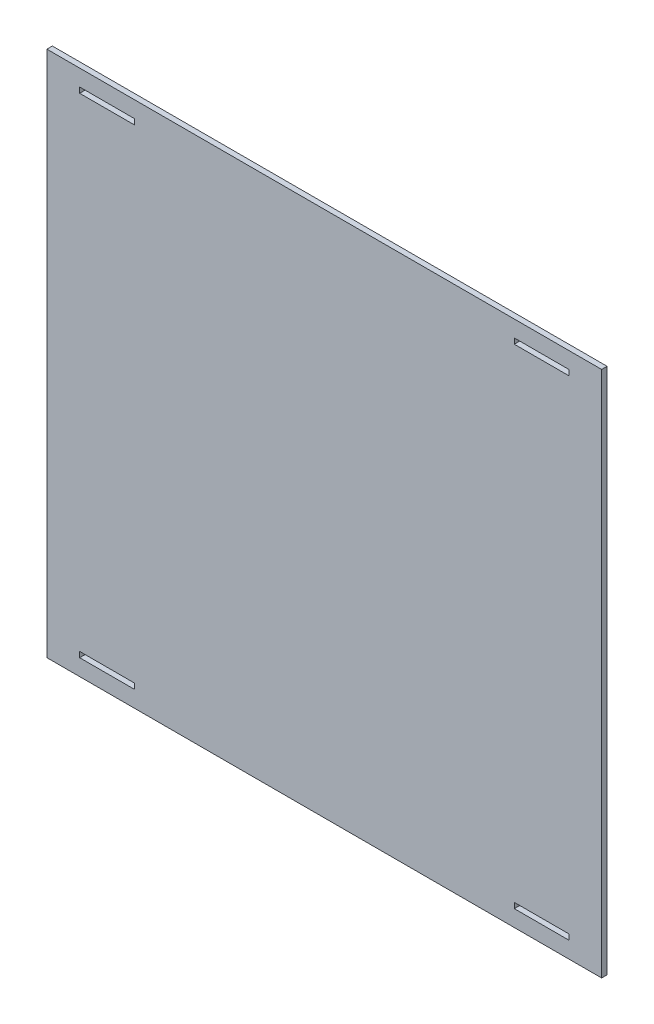
ISO-10303-21;
HEADER;
FILE_DESCRIPTION(('STEP AP214'),'2;1');
FILE_NAME('part.step','',(''),(''),'','','');
FILE_SCHEMA(('AUTOMOTIVE_DESIGN { 1 0 10303 214 1 1 1 1 }'));
ENDSEC;
DATA;
#1=APPLICATION_CONTEXT('core data for automotive mechanical design processes');
#2=APPLICATION_PROTOCOL_DEFINITION('international standard','automotive_design',2000,#1);
#3=PRODUCT_CONTEXT('',#1,'mechanical');
#4=PRODUCT('Part','Part','',(#3));
#5=PRODUCT_RELATED_PRODUCT_CATEGORY('part','',(#4));
#6=PRODUCT_DEFINITION_FORMATION('','',#4);
#7=PRODUCT_DEFINITION_CONTEXT('part definition',#1,'design');
#8=PRODUCT_DEFINITION('design','',#6,#7);
#9=PRODUCT_DEFINITION_SHAPE('','',#8);
#10=(LENGTH_UNIT() NAMED_UNIT(*) SI_UNIT(.MILLI.,.METRE.));
#11=(NAMED_UNIT(*) PLANE_ANGLE_UNIT() SI_UNIT($,.RADIAN.));
#12=(NAMED_UNIT(*) SI_UNIT($,.STERADIAN.) SOLID_ANGLE_UNIT());
#13=UNCERTAINTY_MEASURE_WITH_UNIT(LENGTH_MEASURE(1.E-05),#10,'distance_accuracy_value','');
#14=(GEOMETRIC_REPRESENTATION_CONTEXT(3) GLOBAL_UNCERTAINTY_ASSIGNED_CONTEXT((#13)) GLOBAL_UNIT_ASSIGNED_CONTEXT((#10,
#11,#12)) REPRESENTATION_CONTEXT('',''));
#15=CARTESIAN_POINT('',(0.,0.,0.));
#16=DIRECTION('',(0.,0.,1.));
#17=DIRECTION('',(1.,0.,0.));
#18=AXIS2_PLACEMENT_3D('',#15,#16,#17);
#19=CARTESIAN_POINT('',(0.,0.,5.));
#20=DIRECTION('',(-1.,0.,0.));
#21=DIRECTION('',(0.,-1.,0.));
#22=AXIS2_PLACEMENT_3D('',#19,#20,#21);
#23=PLANE('',#22);
#24=DIRECTION('',(0.,1.,0.));
#25=VECTOR('',#24,1.);
#26=CARTESIAN_POINT('',(0.,0.,0.));
#27=LINE('',#26,#25);
#28=CARTESIAN_POINT('',(0.,0.,0.));
#29=VERTEX_POINT('',#28);
#30=CARTESIAN_POINT('',(0.,482.6,0.));
#31=VERTEX_POINT('',#30);
#32=EDGE_CURVE('E298',#29,#31,#27,.T.);
#33=ORIENTED_EDGE('',*,*,#32,.T.);
#34=DIRECTION('',(0.,0.,-1.));
#35=VECTOR('',#34,1.);
#36=CARTESIAN_POINT('',(0.,482.6,5.));
#37=LINE('',#36,#35);
#38=CARTESIAN_POINT('',(0.,482.6,5.));
#39=VERTEX_POINT('',#38);
#40=EDGE_CURVE('E11',#39,#31,#37,.T.);
#41=ORIENTED_EDGE('',*,*,#40,.F.);
#42=DIRECTION('',(0.,1.,0.));
#43=VECTOR('',#42,1.);
#44=CARTESIAN_POINT('',(0.,0.,5.));
#45=LINE('',#44,#43);
#46=CARTESIAN_POINT('',(0.,0.,5.));
#47=VERTEX_POINT('',#46);
#48=EDGE_CURVE('E305',#47,#39,#45,.T.);
#49=ORIENTED_EDGE('',*,*,#48,.F.);
#50=DIRECTION('',(0.,0.,-1.));
#51=VECTOR('',#50,1.);
#52=CARTESIAN_POINT('',(0.,0.,5.));
#53=LINE('',#52,#51);
#54=EDGE_CURVE('E315',#47,#29,#53,.T.);
#55=ORIENTED_EDGE('',*,*,#54,.T.);
#56=EDGE_LOOP('',(#33,#41,#49,#55));
#57=FACE_BOUND('',#56,.T.);
#58=ADVANCED_FACE('F33',(#57),#23,.F.);
#59=CARTESIAN_POINT('',(0.,482.6,5.));
#60=DIRECTION('',(0.,-1.,0.));
#61=DIRECTION('',(1.,0.,0.));
#62=AXIS2_PLACEMENT_3D('',#59,#60,#61);
#63=PLANE('',#62);
#64=DIRECTION('',(-1.,0.,0.));
#65=VECTOR('',#64,1.);
#66=CARTESIAN_POINT('',(0.,482.6,0.));
#67=LINE('',#66,#65);
#68=CARTESIAN_POINT('',(-508.,482.6,0.));
#69=VERTEX_POINT('',#68);
#70=EDGE_CURVE('E318',#31,#69,#67,.T.);
#71=ORIENTED_EDGE('',*,*,#70,.T.);
#72=DIRECTION('',(0.,0.,-1.));
#73=VECTOR('',#72,1.);
#74=CARTESIAN_POINT('',(-508.,482.6,5.));
#75=LINE('',#74,#73);
#76=CARTESIAN_POINT('',(-508.,482.6,5.));
#77=VERTEX_POINT('',#76);
#78=EDGE_CURVE('E40',#77,#69,#75,.T.);
#79=ORIENTED_EDGE('',*,*,#78,.F.);
#80=DIRECTION('',(-1.,0.,0.));
#81=VECTOR('',#80,1.);
#82=CARTESIAN_POINT('',(0.,482.6,5.));
#83=LINE('',#82,#81);
#84=EDGE_CURVE('E308',#39,#77,#83,.T.);
#85=ORIENTED_EDGE('',*,*,#84,.F.);
#86=ORIENTED_EDGE('',*,*,#40,.T.);
#87=EDGE_LOOP('',(#71,#79,#85,#86));
#88=FACE_BOUND('',#87,.T.);
#89=ADVANCED_FACE('F347',(#88),#63,.F.);
#90=CARTESIAN_POINT('',(-508.,0.,5.));
#91=DIRECTION('',(1.,0.,0.));
#92=DIRECTION('',(0.,0.,-1.));
#93=AXIS2_PLACEMENT_3D('',#90,#91,#92);
#94=PLANE('',#93);
#95=DIRECTION('',(0.,-1.,0.));
#96=VECTOR('',#95,1.);
#97=CARTESIAN_POINT('',(-508.,0.,0.));
#98=LINE('',#97,#96);
#99=CARTESIAN_POINT('',(-508.,0.,0.));
#100=VERTEX_POINT('',#99);
#101=EDGE_CURVE('E320',#69,#100,#98,.T.);
#102=ORIENTED_EDGE('',*,*,#101,.T.);
#103=DIRECTION('',(0.,0.,-1.));
#104=VECTOR('',#103,1.);
#105=CARTESIAN_POINT('',(-508.,0.,5.));
#106=LINE('',#105,#104);
#107=CARTESIAN_POINT('',(-508.,0.,5.));
#108=VERTEX_POINT('',#107);
#109=EDGE_CURVE('E325',#108,#100,#106,.T.);
#110=ORIENTED_EDGE('',*,*,#109,.F.);
#111=DIRECTION('',(0.,-1.,0.));
#112=VECTOR('',#111,1.);
#113=CARTESIAN_POINT('',(-508.,0.,5.));
#114=LINE('',#113,#112);
#115=EDGE_CURVE('E311',#77,#108,#114,.T.);
#116=ORIENTED_EDGE('',*,*,#115,.F.);
#117=ORIENTED_EDGE('',*,*,#78,.T.);
#118=EDGE_LOOP('',(#102,#110,#116,#117));
#119=FACE_BOUND('',#118,.T.);
#120=ADVANCED_FACE('F332',(#119),#94,.F.);
#121=CARTESIAN_POINT('',(0.,0.,5.));
#122=DIRECTION('',(0.,1.,0.));
#123=DIRECTION('',(-1.,0.,0.));
#124=AXIS2_PLACEMENT_3D('',#121,#122,#123);
#125=PLANE('',#124);
#126=DIRECTION('',(1.,0.,0.));
#127=VECTOR('',#126,1.);
#128=CARTESIAN_POINT('',(0.,0.,0.));
#129=LINE('',#128,#127);
#130=EDGE_CURVE('E309',#100,#29,#129,.T.);
#131=ORIENTED_EDGE('',*,*,#130,.T.);
#132=ORIENTED_EDGE('',*,*,#54,.F.);
#133=DIRECTION('',(1.,0.,0.));
#134=VECTOR('',#133,1.);
#135=CARTESIAN_POINT('',(0.,0.,5.));
#136=LINE('',#135,#134);
#137=EDGE_CURVE('E313',#108,#47,#136,.T.);
#138=ORIENTED_EDGE('',*,*,#137,.F.);
#139=ORIENTED_EDGE('',*,*,#109,.T.);
#140=EDGE_LOOP('',(#131,#132,#138,#139));
#141=FACE_BOUND('',#140,.T.);
#142=ADVANCED_FACE('F340',(#141),#125,.F.);
#143=CARTESIAN_POINT('',(0.,0.,5.));
#144=DIRECTION('',(0.,0.,1.));
#145=DIRECTION('',(1.,0.,0.));
#146=AXIS2_PLACEMENT_3D('',#143,#144,#145);
#147=PLANE('',#146);
#148=DIRECTION('',(0.,-1.,0.));
#149=VECTOR('',#148,1.);
#150=CARTESIAN_POINT('',(-478.,19.9999999999999,5.));
#151=LINE('',#150,#149);
#152=CARTESIAN_POINT('',(-478.,19.9999999999999,5.));
#153=VERTEX_POINT('',#152);
#154=CARTESIAN_POINT('',(-478.,14.9999999999999,5.));
#155=VERTEX_POINT('',#154);
#156=EDGE_CURVE('E47',#153,#155,#151,.T.);
#157=ORIENTED_EDGE('',*,*,#156,.F.);
#158=DIRECTION('',(-1.,0.,0.));
#159=VECTOR('',#158,1.);
#160=CARTESIAN_POINT('',(-478.,19.9999999999999,5.));
#161=LINE('',#160,#159);
#162=CARTESIAN_POINT('',(-428.,19.9999999999999,5.));
#163=VERTEX_POINT('',#162);
#164=EDGE_CURVE('E248',#163,#153,#161,.T.);
#165=ORIENTED_EDGE('',*,*,#164,.F.);
#166=DIRECTION('',(0.,1.,0.));
#167=VECTOR('',#166,1.);
#168=CARTESIAN_POINT('',(-428.,19.9999999999999,5.));
#169=LINE('',#168,#167);
#170=CARTESIAN_POINT('',(-428.,14.9999999999999,5.));
#171=VERTEX_POINT('',#170);
#172=EDGE_CURVE('E262',#171,#163,#169,.T.);
#173=ORIENTED_EDGE('',*,*,#172,.F.);
#174=DIRECTION('',(1.,0.,0.));
#175=VECTOR('',#174,1.);
#176=CARTESIAN_POINT('',(-478.,14.9999999999999,5.));
#177=LINE('',#176,#175);
#178=EDGE_CURVE('E259',#155,#171,#177,.T.);
#179=ORIENTED_EDGE('',*,*,#178,.F.);
#180=EDGE_LOOP('',(#157,#165,#173,#179));
#181=FACE_BOUND('',#180,.T.);
#182=DIRECTION('',(0.,1.,0.));
#183=VECTOR('',#182,1.);
#184=CARTESIAN_POINT('',(-30.,15.,5.));
#185=LINE('',#184,#183);
#186=CARTESIAN_POINT('',(-30.,15.,5.));
#187=VERTEX_POINT('',#186);
#188=CARTESIAN_POINT('',(-30.,20.,5.));
#189=VERTEX_POINT('',#188);
#190=EDGE_CURVE('E55',#187,#189,#185,.T.);
#191=ORIENTED_EDGE('',*,*,#190,.F.);
#192=DIRECTION('',(1.,0.,0.));
#193=VECTOR('',#192,1.);
#194=CARTESIAN_POINT('',(-30.,15.,5.));
#195=LINE('',#194,#193);
#196=CARTESIAN_POINT('',(-80.,15.,5.));
#197=VERTEX_POINT('',#196);
#198=EDGE_CURVE('E218',#197,#187,#195,.T.);
#199=ORIENTED_EDGE('',*,*,#198,.F.);
#200=DIRECTION('',(0.,-1.,0.));
#201=VECTOR('',#200,1.);
#202=CARTESIAN_POINT('',(-80.,15.,5.));
#203=LINE('',#202,#201);
#204=CARTESIAN_POINT('',(-80.,20.,5.));
#205=VERTEX_POINT('',#204);
#206=EDGE_CURVE('E233',#205,#197,#203,.T.);
#207=ORIENTED_EDGE('',*,*,#206,.F.);
#208=DIRECTION('',(-1.,0.,0.));
#209=VECTOR('',#208,1.);
#210=CARTESIAN_POINT('',(-30.,20.,5.));
#211=LINE('',#210,#209);
#212=EDGE_CURVE('E229',#189,#205,#211,.T.);
#213=ORIENTED_EDGE('',*,*,#212,.F.);
#214=EDGE_LOOP('',(#191,#199,#207,#213));
#215=FACE_BOUND('',#214,.T.);
#216=DIRECTION('',(0.,1.,0.));
#217=VECTOR('',#216,1.);
#218=CARTESIAN_POINT('',(-30.,467.6,5.));
#219=LINE('',#218,#217);
#220=CARTESIAN_POINT('',(-30.,462.6,5.));
#221=VERTEX_POINT('',#220);
#222=CARTESIAN_POINT('',(-30.,467.6,5.));
#223=VERTEX_POINT('',#222);
#224=EDGE_CURVE('E176',#221,#223,#219,.T.);
#225=ORIENTED_EDGE('',*,*,#224,.F.);
#226=DIRECTION('',(1.,0.,0.));
#227=VECTOR('',#226,1.);
#228=CARTESIAN_POINT('',(-30.,462.6,5.));
#229=LINE('',#228,#227);
#230=CARTESIAN_POINT('',(-80.,462.6,5.));
#231=VERTEX_POINT('',#230);
#232=EDGE_CURVE('E194',#231,#221,#229,.T.);
#233=ORIENTED_EDGE('',*,*,#232,.F.);
#234=DIRECTION('',(0.,-1.,0.));
#235=VECTOR('',#234,1.);
#236=CARTESIAN_POINT('',(-80.,467.6,5.));
#237=LINE('',#236,#235);
#238=CARTESIAN_POINT('',(-80.,467.6,5.));
#239=VERTEX_POINT('',#238);
#240=EDGE_CURVE('E197',#239,#231,#237,.T.);
#241=ORIENTED_EDGE('',*,*,#240,.F.);
#242=DIRECTION('',(-1.,0.,0.));
#243=VECTOR('',#242,1.);
#244=CARTESIAN_POINT('',(-30.,467.6,5.));
#245=LINE('',#244,#243);
#246=EDGE_CURVE('E203',#223,#239,#245,.T.);
#247=ORIENTED_EDGE('',*,*,#246,.F.);
#248=EDGE_LOOP('',(#225,#233,#241,#247));
#249=FACE_BOUND('',#248,.T.);
#250=DIRECTION('',(0.,-1.,0.));
#251=VECTOR('',#250,1.);
#252=CARTESIAN_POINT('',(-478.,467.6,5.));
#253=LINE('',#252,#251);
#254=CARTESIAN_POINT('',(-478.,467.6,5.));
#255=VERTEX_POINT('',#254);
#256=CARTESIAN_POINT('',(-478.,462.6,5.));
#257=VERTEX_POINT('',#256);
#258=EDGE_CURVE('E210',#255,#257,#253,.T.);
#259=ORIENTED_EDGE('',*,*,#258,.F.);
#260=DIRECTION('',(-1.,0.,0.));
#261=VECTOR('',#260,1.);
#262=CARTESIAN_POINT('',(-478.,467.6,5.));
#263=LINE('',#262,#261);
#264=CARTESIAN_POINT('',(-428.,467.6,5.));
#265=VERTEX_POINT('',#264);
#266=EDGE_CURVE('E277',#265,#255,#263,.T.);
#267=ORIENTED_EDGE('',*,*,#266,.F.);
#268=DIRECTION('',(0.,1.,0.));
#269=VECTOR('',#268,1.);
#270=CARTESIAN_POINT('',(-428.,467.6,5.));
#271=LINE('',#270,#269);
#272=CARTESIAN_POINT('',(-428.,462.6,5.));
#273=VERTEX_POINT('',#272);
#274=EDGE_CURVE('E291',#273,#265,#271,.T.);
#275=ORIENTED_EDGE('',*,*,#274,.F.);
#276=DIRECTION('',(1.,0.,0.));
#277=VECTOR('',#276,1.);
#278=CARTESIAN_POINT('',(-478.,462.6,5.));
#279=LINE('',#278,#277);
#280=EDGE_CURVE('E288',#257,#273,#279,.T.);
#281=ORIENTED_EDGE('',*,*,#280,.F.);
#282=EDGE_LOOP('',(#259,#267,#275,#281));
#283=FACE_BOUND('',#282,.T.);
#284=ORIENTED_EDGE('',*,*,#48,.T.);
#285=ORIENTED_EDGE('',*,*,#84,.T.);
#286=ORIENTED_EDGE('',*,*,#115,.T.);
#287=ORIENTED_EDGE('',*,*,#137,.T.);
#288=EDGE_LOOP('',(#284,#285,#286,#287));
#289=FACE_BOUND('',#288,.T.);
#290=ADVANCED_FACE('F346',(#181,#215,#249,#283,#289),#147,.T.);
#291=CARTESIAN_POINT('',(0.,0.,0.));
#292=DIRECTION('',(0.,0.,1.));
#293=DIRECTION('',(1.,0.,0.));
#294=AXIS2_PLACEMENT_3D('',#291,#292,#293);
#295=PLANE('',#294);
#296=DIRECTION('',(-1.,0.,0.));
#297=VECTOR('',#296,1.);
#298=CARTESIAN_POINT('',(-478.,19.9999999999999,0.));
#299=LINE('',#298,#297);
#300=CARTESIAN_POINT('',(-428.,19.9999999999999,0.));
#301=VERTEX_POINT('',#300);
#302=CARTESIAN_POINT('',(-478.,19.9999999999999,0.));
#303=VERTEX_POINT('',#302);
#304=EDGE_CURVE('E254',#301,#303,#299,.T.);
#305=ORIENTED_EDGE('',*,*,#304,.T.);
#306=DIRECTION('',(0.,-1.,0.));
#307=VECTOR('',#306,1.);
#308=CARTESIAN_POINT('',(-478.,19.9999999999999,0.));
#309=LINE('',#308,#307);
#310=CARTESIAN_POINT('',(-478.,14.9999999999999,0.));
#311=VERTEX_POINT('',#310);
#312=EDGE_CURVE('E244',#303,#311,#309,.T.);
#313=ORIENTED_EDGE('',*,*,#312,.T.);
#314=DIRECTION('',(1.,0.,0.));
#315=VECTOR('',#314,1.);
#316=CARTESIAN_POINT('',(-478.,14.9999999999999,0.));
#317=LINE('',#316,#315);
#318=CARTESIAN_POINT('',(-428.,14.9999999999999,0.));
#319=VERTEX_POINT('',#318);
#320=EDGE_CURVE('E247',#311,#319,#317,.T.);
#321=ORIENTED_EDGE('',*,*,#320,.T.);
#322=DIRECTION('',(0.,1.,0.));
#323=VECTOR('',#322,1.);
#324=CARTESIAN_POINT('',(-428.,19.9999999999999,0.));
#325=LINE('',#324,#323);
#326=EDGE_CURVE('E251',#319,#301,#325,.T.);
#327=ORIENTED_EDGE('',*,*,#326,.T.);
#328=EDGE_LOOP('',(#305,#313,#321,#327));
#329=FACE_BOUND('',#328,.T.);
#330=DIRECTION('',(1.,0.,0.));
#331=VECTOR('',#330,1.);
#332=CARTESIAN_POINT('',(-30.,15.,0.));
#333=LINE('',#332,#331);
#334=CARTESIAN_POINT('',(-80.,15.,0.));
#335=VERTEX_POINT('',#334);
#336=CARTESIAN_POINT('',(-30.,15.,0.));
#337=VERTEX_POINT('',#336);
#338=EDGE_CURVE('E224',#335,#337,#333,.T.);
#339=ORIENTED_EDGE('',*,*,#338,.T.);
#340=DIRECTION('',(0.,1.,0.));
#341=VECTOR('',#340,1.);
#342=CARTESIAN_POINT('',(-30.,15.,0.));
#343=LINE('',#342,#341);
#344=CARTESIAN_POINT('',(-30.,20.,0.));
#345=VERTEX_POINT('',#344);
#346=EDGE_CURVE('E214',#337,#345,#343,.T.);
#347=ORIENTED_EDGE('',*,*,#346,.T.);
#348=DIRECTION('',(-1.,0.,0.));
#349=VECTOR('',#348,1.);
#350=CARTESIAN_POINT('',(-30.,20.,0.));
#351=LINE('',#350,#349);
#352=CARTESIAN_POINT('',(-80.,20.,0.));
#353=VERTEX_POINT('',#352);
#354=EDGE_CURVE('E217',#345,#353,#351,.T.);
#355=ORIENTED_EDGE('',*,*,#354,.T.);
#356=DIRECTION('',(0.,-1.,0.));
#357=VECTOR('',#356,1.);
#358=CARTESIAN_POINT('',(-80.,15.,0.));
#359=LINE('',#358,#357);
#360=EDGE_CURVE('E221',#353,#335,#359,.T.);
#361=ORIENTED_EDGE('',*,*,#360,.T.);
#362=EDGE_LOOP('',(#339,#347,#355,#361));
#363=FACE_BOUND('',#362,.T.);
#364=DIRECTION('',(1.,0.,0.));
#365=VECTOR('',#364,1.);
#366=CARTESIAN_POINT('',(-30.,462.6,0.));
#367=LINE('',#366,#365);
#368=CARTESIAN_POINT('',(-80.,462.6,0.));
#369=VERTEX_POINT('',#368);
#370=CARTESIAN_POINT('',(-30.,462.6,0.));
#371=VERTEX_POINT('',#370);
#372=EDGE_CURVE('E181',#369,#371,#367,.T.);
#373=ORIENTED_EDGE('',*,*,#372,.T.);
#374=DIRECTION('',(0.,1.,0.));
#375=VECTOR('',#374,1.);
#376=CARTESIAN_POINT('',(-30.,467.6,0.));
#377=LINE('',#376,#375);
#378=CARTESIAN_POINT('',(-30.,467.6,0.));
#379=VERTEX_POINT('',#378);
#380=EDGE_CURVE('E173',#371,#379,#377,.T.);
#381=ORIENTED_EDGE('',*,*,#380,.T.);
#382=DIRECTION('',(-1.,0.,0.));
#383=VECTOR('',#382,1.);
#384=CARTESIAN_POINT('',(-30.,467.6,0.));
#385=LINE('',#384,#383);
#386=CARTESIAN_POINT('',(-80.,467.6,0.));
#387=VERTEX_POINT('',#386);
#388=EDGE_CURVE('E185',#379,#387,#385,.T.);
#389=ORIENTED_EDGE('',*,*,#388,.T.);
#390=DIRECTION('',(0.,-1.,0.));
#391=VECTOR('',#390,1.);
#392=CARTESIAN_POINT('',(-80.,467.6,0.));
#393=LINE('',#392,#391);
#394=EDGE_CURVE('E189',#387,#369,#393,.T.);
#395=ORIENTED_EDGE('',*,*,#394,.T.);
#396=EDGE_LOOP('',(#373,#381,#389,#395));
#397=FACE_BOUND('',#396,.T.);
#398=DIRECTION('',(-1.,0.,0.));
#399=VECTOR('',#398,1.);
#400=CARTESIAN_POINT('',(-478.,467.6,0.));
#401=LINE('',#400,#399);
#402=CARTESIAN_POINT('',(-428.,467.6,0.));
#403=VERTEX_POINT('',#402);
#404=CARTESIAN_POINT('',(-478.,467.6,0.));
#405=VERTEX_POINT('',#404);
#406=EDGE_CURVE('E283',#403,#405,#401,.T.);
#407=ORIENTED_EDGE('',*,*,#406,.T.);
#408=DIRECTION('',(0.,-1.,0.));
#409=VECTOR('',#408,1.);
#410=CARTESIAN_POINT('',(-478.,467.6,0.));
#411=LINE('',#410,#409);
#412=CARTESIAN_POINT('',(-478.,462.6,0.));
#413=VERTEX_POINT('',#412);
#414=EDGE_CURVE('E273',#405,#413,#411,.T.);
#415=ORIENTED_EDGE('',*,*,#414,.T.);
#416=DIRECTION('',(1.,0.,0.));
#417=VECTOR('',#416,1.);
#418=CARTESIAN_POINT('',(-478.,462.6,0.));
#419=LINE('',#418,#417);
#420=CARTESIAN_POINT('',(-428.,462.6,0.));
#421=VERTEX_POINT('',#420);
#422=EDGE_CURVE('E276',#413,#421,#419,.T.);
#423=ORIENTED_EDGE('',*,*,#422,.T.);
#424=DIRECTION('',(0.,1.,0.));
#425=VECTOR('',#424,1.);
#426=CARTESIAN_POINT('',(-428.,467.6,0.));
#427=LINE('',#426,#425);
#428=EDGE_CURVE('E280',#421,#403,#427,.T.);
#429=ORIENTED_EDGE('',*,*,#428,.T.);
#430=EDGE_LOOP('',(#407,#415,#423,#429));
#431=FACE_BOUND('',#430,.T.);
#432=ORIENTED_EDGE('',*,*,#32,.F.);
#433=ORIENTED_EDGE('',*,*,#130,.F.);
#434=ORIENTED_EDGE('',*,*,#101,.F.);
#435=ORIENTED_EDGE('',*,*,#70,.F.);
#436=EDGE_LOOP('',(#432,#433,#434,#435));
#437=FACE_BOUND('',#436,.T.);
#438=ADVANCED_FACE('F191',(#329,#363,#397,#431,#437),#295,.F.);
#439=CARTESIAN_POINT('',(-478.,467.6,0.));
#440=DIRECTION('',(-1.,0.,0.));
#441=DIRECTION('',(0.,0.,1.));
#442=AXIS2_PLACEMENT_3D('',#439,#440,#441);
#443=PLANE('',#442);
#444=ORIENTED_EDGE('',*,*,#258,.T.);
#445=DIRECTION('',(0.,0.,1.));
#446=VECTOR('',#445,1.);
#447=CARTESIAN_POINT('',(-478.,462.6,0.));
#448=LINE('',#447,#446);
#449=EDGE_CURVE('E286',#413,#257,#448,.T.);
#450=ORIENTED_EDGE('',*,*,#449,.F.);
#451=ORIENTED_EDGE('',*,*,#414,.F.);
#452=DIRECTION('',(0.,0.,1.));
#453=VECTOR('',#452,1.);
#454=CARTESIAN_POINT('',(-478.,467.6,0.));
#455=LINE('',#454,#453);
#456=EDGE_CURVE('E296',#405,#255,#455,.T.);
#457=ORIENTED_EDGE('',*,*,#456,.T.);
#458=EDGE_LOOP('',(#444,#450,#451,#457));
#459=FACE_BOUND('',#458,.T.);
#460=ADVANCED_FACE('F359',(#459),#443,.F.);
#461=CARTESIAN_POINT('',(-478.,467.6,0.));
#462=DIRECTION('',(0.,1.,0.));
#463=DIRECTION('',(-1.,0.,0.));
#464=AXIS2_PLACEMENT_3D('',#461,#462,#463);
#465=PLANE('',#464);
#466=ORIENTED_EDGE('',*,*,#266,.T.);
#467=ORIENTED_EDGE('',*,*,#456,.F.);
#468=ORIENTED_EDGE('',*,*,#406,.F.);
#469=DIRECTION('',(0.,0.,1.));
#470=VECTOR('',#469,1.);
#471=CARTESIAN_POINT('',(-428.,467.6,0.));
#472=LINE('',#471,#470);
#473=EDGE_CURVE('E299',#403,#265,#472,.T.);
#474=ORIENTED_EDGE('',*,*,#473,.T.);
#475=EDGE_LOOP('',(#466,#467,#468,#474));
#476=FACE_BOUND('',#475,.T.);
#477=ADVANCED_FACE('F366',(#476),#465,.F.);
#478=CARTESIAN_POINT('',(-428.,467.6,0.));
#479=DIRECTION('',(1.,0.,0.));
#480=DIRECTION('',(0.,1.,0.));
#481=AXIS2_PLACEMENT_3D('',#478,#479,#480);
#482=PLANE('',#481);
#483=ORIENTED_EDGE('',*,*,#274,.T.);
#484=ORIENTED_EDGE('',*,*,#473,.F.);
#485=ORIENTED_EDGE('',*,*,#428,.F.);
#486=DIRECTION('',(0.,0.,1.));
#487=VECTOR('',#486,1.);
#488=CARTESIAN_POINT('',(-428.,462.6,0.));
#489=LINE('',#488,#487);
#490=EDGE_CURVE('E301',#421,#273,#489,.T.);
#491=ORIENTED_EDGE('',*,*,#490,.T.);
#492=EDGE_LOOP('',(#483,#484,#485,#491));
#493=FACE_BOUND('',#492,.T.);
#494=ADVANCED_FACE('F371',(#493),#482,.F.);
#495=CARTESIAN_POINT('',(-478.,462.6,0.));
#496=DIRECTION('',(0.,-1.,0.));
#497=DIRECTION('',(0.,0.,-1.));
#498=AXIS2_PLACEMENT_3D('',#495,#496,#497);
#499=PLANE('',#498);
#500=ORIENTED_EDGE('',*,*,#280,.T.);
#501=ORIENTED_EDGE('',*,*,#490,.F.);
#502=ORIENTED_EDGE('',*,*,#422,.F.);
#503=ORIENTED_EDGE('',*,*,#449,.T.);
#504=EDGE_LOOP('',(#500,#501,#502,#503));
#505=FACE_BOUND('',#504,.T.);
#506=ADVANCED_FACE('F368',(#505),#499,.F.);
#507=CARTESIAN_POINT('',(-30.,467.6,0.));
#508=DIRECTION('',(1.,0.,0.));
#509=DIRECTION('',(0.,0.,-1.));
#510=AXIS2_PLACEMENT_3D('',#507,#508,#509);
#511=PLANE('',#510);
#512=ORIENTED_EDGE('',*,*,#224,.T.);
#513=DIRECTION('',(0.,0.,1.));
#514=VECTOR('',#513,1.);
#515=CARTESIAN_POINT('',(-30.,467.6,0.));
#516=LINE('',#515,#514);
#517=EDGE_CURVE('E169',#379,#223,#516,.T.);
#518=ORIENTED_EDGE('',*,*,#517,.F.);
#519=ORIENTED_EDGE('',*,*,#380,.F.);
#520=DIRECTION('',(0.,0.,1.));
#521=VECTOR('',#520,1.);
#522=CARTESIAN_POINT('',(-30.,462.6,0.));
#523=LINE('',#522,#521);
#524=EDGE_CURVE('E208',#371,#221,#523,.T.);
#525=ORIENTED_EDGE('',*,*,#524,.T.);
#526=EDGE_LOOP('',(#512,#518,#519,#525));
#527=FACE_BOUND('',#526,.T.);
#528=ADVANCED_FACE('F171',(#527),#511,.F.);
#529=CARTESIAN_POINT('',(-30.,462.6,0.));
#530=DIRECTION('',(0.,-1.,0.));
#531=DIRECTION('',(0.,0.,-1.));
#532=AXIS2_PLACEMENT_3D('',#529,#530,#531);
#533=PLANE('',#532);
#534=ORIENTED_EDGE('',*,*,#232,.T.);
#535=ORIENTED_EDGE('',*,*,#524,.F.);
#536=ORIENTED_EDGE('',*,*,#372,.F.);
#537=DIRECTION('',(0.,0.,1.));
#538=VECTOR('',#537,1.);
#539=CARTESIAN_POINT('',(-80.,462.6,0.));
#540=LINE('',#539,#538);
#541=EDGE_CURVE('E211',#369,#231,#540,.T.);
#542=ORIENTED_EDGE('',*,*,#541,.T.);
#543=EDGE_LOOP('',(#534,#535,#536,#542));
#544=FACE_BOUND('',#543,.T.);
#545=ADVANCED_FACE('F411',(#544),#533,.F.);
#546=CARTESIAN_POINT('',(-80.,467.6,0.));
#547=DIRECTION('',(-1.,0.,0.));
#548=DIRECTION('',(0.,-1.,0.));
#549=AXIS2_PLACEMENT_3D('',#546,#547,#548);
#550=PLANE('',#549);
#551=ORIENTED_EDGE('',*,*,#240,.T.);
#552=ORIENTED_EDGE('',*,*,#541,.F.);
#553=ORIENTED_EDGE('',*,*,#394,.F.);
#554=DIRECTION('',(0.,0.,1.));
#555=VECTOR('',#554,1.);
#556=CARTESIAN_POINT('',(-80.,467.6,0.));
#557=LINE('',#556,#555);
#558=EDGE_CURVE('E180',#387,#239,#557,.T.);
#559=ORIENTED_EDGE('',*,*,#558,.T.);
#560=EDGE_LOOP('',(#551,#552,#553,#559));
#561=FACE_BOUND('',#560,.T.);
#562=ADVANCED_FACE('F414',(#561),#550,.F.);
#563=CARTESIAN_POINT('',(-30.,467.6,0.));
#564=DIRECTION('',(0.,1.,0.));
#565=DIRECTION('',(-1.,0.,0.));
#566=AXIS2_PLACEMENT_3D('',#563,#564,#565);
#567=PLANE('',#566);
#568=ORIENTED_EDGE('',*,*,#246,.T.);
#569=ORIENTED_EDGE('',*,*,#558,.F.);
#570=ORIENTED_EDGE('',*,*,#388,.F.);
#571=ORIENTED_EDGE('',*,*,#517,.T.);
#572=EDGE_LOOP('',(#568,#569,#570,#571));
#573=FACE_BOUND('',#572,.T.);
#574=ADVANCED_FACE('F186',(#573),#567,.F.);
#575=CARTESIAN_POINT('',(-30.,15.,0.));
#576=DIRECTION('',(1.,0.,0.));
#577=DIRECTION('',(0.,0.,-1.));
#578=AXIS2_PLACEMENT_3D('',#575,#576,#577);
#579=PLANE('',#578);
#580=ORIENTED_EDGE('',*,*,#190,.T.);
#581=DIRECTION('',(0.,0.,1.));
#582=VECTOR('',#581,1.);
#583=CARTESIAN_POINT('',(-30.,20.,0.));
#584=LINE('',#583,#582);
#585=EDGE_CURVE('E227',#345,#189,#584,.T.);
#586=ORIENTED_EDGE('',*,*,#585,.F.);
#587=ORIENTED_EDGE('',*,*,#346,.F.);
#588=DIRECTION('',(0.,0.,1.));
#589=VECTOR('',#588,1.);
#590=CARTESIAN_POINT('',(-30.,15.,0.));
#591=LINE('',#590,#589);
#592=EDGE_CURVE('E204',#337,#187,#591,.T.);
#593=ORIENTED_EDGE('',*,*,#592,.T.);
#594=EDGE_LOOP('',(#580,#586,#587,#593));
#595=FACE_BOUND('',#594,.T.);
#596=ADVANCED_FACE('F395',(#595),#579,.F.);
#597=CARTESIAN_POINT('',(-30.,15.,0.));
#598=DIRECTION('',(0.,-1.,0.));
#599=DIRECTION('',(1.,0.,0.));
#600=AXIS2_PLACEMENT_3D('',#597,#598,#599);
#601=PLANE('',#600);
#602=ORIENTED_EDGE('',*,*,#198,.T.);
#603=ORIENTED_EDGE('',*,*,#592,.F.);
#604=ORIENTED_EDGE('',*,*,#338,.F.);
#605=DIRECTION('',(0.,0.,1.));
#606=VECTOR('',#605,1.);
#607=CARTESIAN_POINT('',(-80.,15.,0.));
#608=LINE('',#607,#606);
#609=EDGE_CURVE('E239',#335,#197,#608,.T.);
#610=ORIENTED_EDGE('',*,*,#609,.T.);
#611=EDGE_LOOP('',(#602,#603,#604,#610));
#612=FACE_BOUND('',#611,.T.);
#613=ADVANCED_FACE('F398',(#612),#601,.F.);
#614=CARTESIAN_POINT('',(-80.,15.,0.));
#615=DIRECTION('',(-1.,0.,0.));
#616=DIRECTION('',(0.,0.,1.));
#617=AXIS2_PLACEMENT_3D('',#614,#615,#616);
#618=PLANE('',#617);
#619=ORIENTED_EDGE('',*,*,#206,.T.);
#620=ORIENTED_EDGE('',*,*,#609,.F.);
#621=ORIENTED_EDGE('',*,*,#360,.F.);
#622=DIRECTION('',(0.,0.,1.));
#623=VECTOR('',#622,1.);
#624=CARTESIAN_POINT('',(-80.,20.,0.));
#625=LINE('',#624,#623);
#626=EDGE_CURVE('E241',#353,#205,#625,.T.);
#627=ORIENTED_EDGE('',*,*,#626,.T.);
#628=EDGE_LOOP('',(#619,#620,#621,#627));
#629=FACE_BOUND('',#628,.T.);
#630=ADVANCED_FACE('F401',(#629),#618,.F.);
#631=CARTESIAN_POINT('',(-30.,20.,0.));
#632=DIRECTION('',(0.,1.,0.));
#633=DIRECTION('',(-1.,0.,0.));
#634=AXIS2_PLACEMENT_3D('',#631,#632,#633);
#635=PLANE('',#634);
#636=ORIENTED_EDGE('',*,*,#212,.T.);
#637=ORIENTED_EDGE('',*,*,#626,.F.);
#638=ORIENTED_EDGE('',*,*,#354,.F.);
#639=ORIENTED_EDGE('',*,*,#585,.T.);
#640=EDGE_LOOP('',(#636,#637,#638,#639));
#641=FACE_BOUND('',#640,.T.);
#642=ADVANCED_FACE('F383',(#641),#635,.F.);
#643=CARTESIAN_POINT('',(-478.,19.9999999999999,0.));
#644=DIRECTION('',(-1.,0.,0.));
#645=DIRECTION('',(0.,0.,1.));
#646=AXIS2_PLACEMENT_3D('',#643,#644,#645);
#647=PLANE('',#646);
#648=ORIENTED_EDGE('',*,*,#156,.T.);
#649=DIRECTION('',(0.,0.,1.));
#650=VECTOR('',#649,1.);
#651=CARTESIAN_POINT('',(-478.,14.9999999999999,0.));
#652=LINE('',#651,#650);
#653=EDGE_CURVE('E257',#311,#155,#652,.T.);
#654=ORIENTED_EDGE('',*,*,#653,.F.);
#655=ORIENTED_EDGE('',*,*,#312,.F.);
#656=DIRECTION('',(0.,0.,1.));
#657=VECTOR('',#656,1.);
#658=CARTESIAN_POINT('',(-478.,19.9999999999999,0.));
#659=LINE('',#658,#657);
#660=EDGE_CURVE('E230',#303,#153,#659,.T.);
#661=ORIENTED_EDGE('',*,*,#660,.T.);
#662=EDGE_LOOP('',(#648,#654,#655,#661));
#663=FACE_BOUND('',#662,.T.);
#664=ADVANCED_FACE('F379',(#663),#647,.F.);
#665=CARTESIAN_POINT('',(-478.,19.9999999999999,0.));
#666=DIRECTION('',(0.,1.,0.));
#667=DIRECTION('',(0.,0.,1.));
#668=AXIS2_PLACEMENT_3D('',#665,#666,#667);
#669=PLANE('',#668);
#670=ORIENTED_EDGE('',*,*,#164,.T.);
#671=ORIENTED_EDGE('',*,*,#660,.F.);
#672=ORIENTED_EDGE('',*,*,#304,.F.);
#673=DIRECTION('',(0.,0.,1.));
#674=VECTOR('',#673,1.);
#675=CARTESIAN_POINT('',(-428.,19.9999999999999,0.));
#676=LINE('',#675,#674);
#677=EDGE_CURVE('E268',#301,#163,#676,.T.);
#678=ORIENTED_EDGE('',*,*,#677,.T.);
#679=EDGE_LOOP('',(#670,#671,#672,#678));
#680=FACE_BOUND('',#679,.T.);
#681=ADVANCED_FACE('F382',(#680),#669,.F.);
#682=CARTESIAN_POINT('',(-428.,19.9999999999999,0.));
#683=DIRECTION('',(1.,0.,0.));
#684=DIRECTION('',(0.,0.,-1.));
#685=AXIS2_PLACEMENT_3D('',#682,#683,#684);
#686=PLANE('',#685);
#687=ORIENTED_EDGE('',*,*,#172,.T.);
#688=ORIENTED_EDGE('',*,*,#677,.F.);
#689=ORIENTED_EDGE('',*,*,#326,.F.);
#690=DIRECTION('',(0.,0.,1.));
#691=VECTOR('',#690,1.);
#692=CARTESIAN_POINT('',(-428.,14.9999999999999,0.));
#693=LINE('',#692,#691);
#694=EDGE_CURVE('E270',#319,#171,#693,.T.);
#695=ORIENTED_EDGE('',*,*,#694,.T.);
#696=EDGE_LOOP('',(#687,#688,#689,#695));
#697=FACE_BOUND('',#696,.T.);
#698=ADVANCED_FACE('F387',(#697),#686,.F.);
#699=CARTESIAN_POINT('',(-478.,14.9999999999999,0.));
#700=DIRECTION('',(0.,-1.,0.));
#701=DIRECTION('',(0.,0.,-1.));
#702=AXIS2_PLACEMENT_3D('',#699,#700,#701);
#703=PLANE('',#702);
#704=ORIENTED_EDGE('',*,*,#178,.T.);
#705=ORIENTED_EDGE('',*,*,#694,.F.);
#706=ORIENTED_EDGE('',*,*,#320,.F.);
#707=ORIENTED_EDGE('',*,*,#653,.T.);
#708=EDGE_LOOP('',(#704,#705,#706,#707));
#709=FACE_BOUND('',#708,.T.);
#710=ADVANCED_FACE('F384',(#709),#703,.F.);
#711=CLOSED_SHELL('',(#58,#89,#120,#142,#290,#438,#460,#477,#494,#506,#528,#545,#562,#574,#596,
#613,#630,#642,#664,#681,#698,#710));
#712=MANIFOLD_SOLID_BREP('B2',#711);
#713=ADVANCED_BREP_SHAPE_REPRESENTATION('',(#18,#712),#14);
#714=SHAPE_DEFINITION_REPRESENTATION(#9,#713);
ENDSEC;
END-ISO-10303-21;
